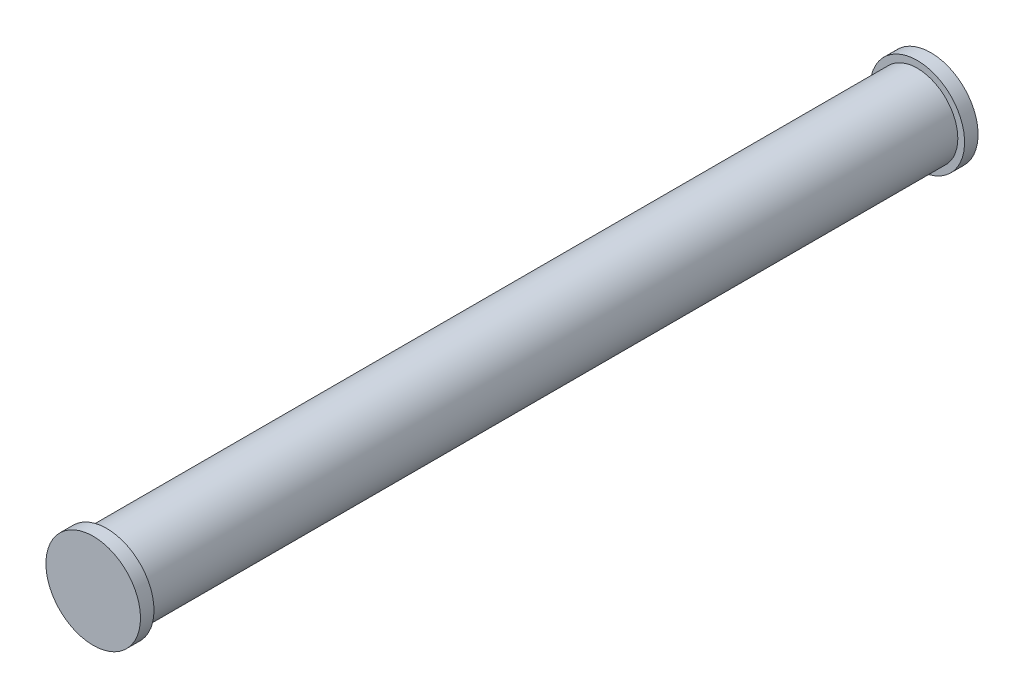
ISO-10303-21;
HEADER;
FILE_DESCRIPTION(('STEP AP214'),'2;1');
FILE_NAME('part.step','',(''),(''),'','','');
FILE_SCHEMA(('AUTOMOTIVE_DESIGN { 1 0 10303 214 1 1 1 1 }'));
ENDSEC;
DATA;
#1=APPLICATION_CONTEXT('core data for automotive mechanical design processes');
#2=APPLICATION_PROTOCOL_DEFINITION('international standard','automotive_design',2000,#1);
#3=PRODUCT_CONTEXT('',#1,'mechanical');
#4=PRODUCT('Part','Part','',(#3));
#5=PRODUCT_RELATED_PRODUCT_CATEGORY('part','',(#4));
#6=PRODUCT_DEFINITION_FORMATION('','',#4);
#7=PRODUCT_DEFINITION_CONTEXT('part definition',#1,'design');
#8=PRODUCT_DEFINITION('design','',#6,#7);
#9=PRODUCT_DEFINITION_SHAPE('','',#8);
#10=(LENGTH_UNIT() NAMED_UNIT(*) SI_UNIT(.MILLI.,.METRE.));
#11=(NAMED_UNIT(*) PLANE_ANGLE_UNIT() SI_UNIT($,.RADIAN.));
#12=(NAMED_UNIT(*) SI_UNIT($,.STERADIAN.) SOLID_ANGLE_UNIT());
#13=UNCERTAINTY_MEASURE_WITH_UNIT(LENGTH_MEASURE(1.E-05),#10,'distance_accuracy_value','');
#14=(GEOMETRIC_REPRESENTATION_CONTEXT(3) GLOBAL_UNCERTAINTY_ASSIGNED_CONTEXT((#13)) GLOBAL_UNIT_ASSIGNED_CONTEXT((#10,
#11,#12)) REPRESENTATION_CONTEXT('',''));
#15=CARTESIAN_POINT('',(0.,0.,0.));
#16=DIRECTION('',(0.,0.,1.));
#17=DIRECTION('',(1.,0.,0.));
#18=AXIS2_PLACEMENT_3D('',#15,#16,#17);
#19=CARTESIAN_POINT('',(0.,0.,-30.));
#20=DIRECTION('',(0.,0.,1.));
#21=DIRECTION('',(1.,0.,0.));
#22=AXIS2_PLACEMENT_3D('',#19,#20,#21);
#23=CYLINDRICAL_SURFACE('',#22,3.);
#24=CARTESIAN_POINT('',(0.,0.,-30.));
#25=DIRECTION('',(0.,0.,1.));
#26=DIRECTION('',(1.,0.,0.));
#27=AXIS2_PLACEMENT_3D('',#24,#25,#26);
#28=CIRCLE('',#27,3.);
#29=CARTESIAN_POINT('',(3.,0.,-30.));
#30=VERTEX_POINT('',#29);
#31=EDGE_CURVE('E40',#30,#30,#28,.T.);
#32=ORIENTED_EDGE('',*,*,#31,.T.);
#33=EDGE_LOOP('',(#32));
#34=FACE_BOUND('',#33,.T.);
#35=CARTESIAN_POINT('',(0.,0.,30.));
#36=DIRECTION('',(0.,0.,1.));
#37=DIRECTION('',(1.,0.,0.));
#38=AXIS2_PLACEMENT_3D('',#35,#36,#37);
#39=CIRCLE('',#38,3.);
#40=CARTESIAN_POINT('',(3.,0.,30.));
#41=VERTEX_POINT('',#40);
#42=EDGE_CURVE('E10',#41,#41,#39,.T.);
#43=ORIENTED_EDGE('',*,*,#42,.F.);
#44=EDGE_LOOP('',(#43));
#45=FACE_BOUND('',#44,.T.);
#46=ADVANCED_FACE('F37',(#34,#45),#23,.T.);
#47=CARTESIAN_POINT('',(0.,0.,31.));
#48=DIRECTION('',(0.,0.,-1.));
#49=DIRECTION('',(-1.,0.,0.));
#50=AXIS2_PLACEMENT_3D('',#47,#48,#49);
#51=CYLINDRICAL_SURFACE('',#50,3.5);
#52=CARTESIAN_POINT('',(0.,0.,31.));
#53=DIRECTION('',(0.,0.,1.));
#54=DIRECTION('',(1.,0.,0.));
#55=AXIS2_PLACEMENT_3D('',#52,#53,#54);
#56=CIRCLE('',#55,3.5);
#57=CARTESIAN_POINT('',(3.5,0.,31.));
#58=VERTEX_POINT('',#57);
#59=EDGE_CURVE('E45',#58,#58,#56,.T.);
#60=ORIENTED_EDGE('',*,*,#59,.F.);
#61=EDGE_LOOP('',(#60));
#62=FACE_BOUND('',#61,.T.);
#63=CARTESIAN_POINT('',(0.,0.,30.));
#64=DIRECTION('',(0.,0.,1.));
#65=DIRECTION('',(1.,0.,0.));
#66=AXIS2_PLACEMENT_3D('',#63,#64,#65);
#67=CIRCLE('',#66,3.5);
#68=CARTESIAN_POINT('',(3.5,0.,30.));
#69=VERTEX_POINT('',#68);
#70=EDGE_CURVE('E50',#69,#69,#67,.T.);
#71=ORIENTED_EDGE('',*,*,#70,.T.);
#72=EDGE_LOOP('',(#71));
#73=FACE_BOUND('',#72,.T.);
#74=ADVANCED_FACE('F92',(#62,#73),#51,.T.);
#75=CARTESIAN_POINT('',(0.,0.,31.));
#76=DIRECTION('',(0.,0.,1.));
#77=DIRECTION('',(1.,0.,0.));
#78=AXIS2_PLACEMENT_3D('',#75,#76,#77);
#79=PLANE('',#78);
#80=ORIENTED_EDGE('',*,*,#59,.T.);
#81=EDGE_LOOP('',(#80));
#82=FACE_BOUND('',#81,.T.);
#83=ADVANCED_FACE('F88',(#82),#79,.T.);
#84=CARTESIAN_POINT('',(0.,0.,30.));
#85=DIRECTION('',(0.,0.,1.));
#86=DIRECTION('',(1.,0.,0.));
#87=AXIS2_PLACEMENT_3D('',#84,#85,#86);
#88=PLANE('',#87);
#89=ORIENTED_EDGE('',*,*,#42,.T.);
#90=EDGE_LOOP('',(#89));
#91=FACE_BOUND('',#90,.T.);
#92=ORIENTED_EDGE('',*,*,#70,.F.);
#93=EDGE_LOOP('',(#92));
#94=FACE_BOUND('',#93,.T.);
#95=ADVANCED_FACE('F80',(#91,#94),#88,.F.);
#96=CARTESIAN_POINT('',(0.,0.,-31.));
#97=DIRECTION('',(0.,0.,1.));
#98=DIRECTION('',(1.,0.,0.));
#99=AXIS2_PLACEMENT_3D('',#96,#97,#98);
#100=CYLINDRICAL_SURFACE('',#99,3.5);
#101=CARTESIAN_POINT('',(0.,0.,-31.));
#102=DIRECTION('',(0.,0.,-1.));
#103=DIRECTION('',(-1.,0.,0.));
#104=AXIS2_PLACEMENT_3D('',#101,#102,#103);
#105=CIRCLE('',#104,3.5);
#106=CARTESIAN_POINT('',(-3.5,0.,-31.));
#107=VERTEX_POINT('',#106);
#108=EDGE_CURVE('E60',#107,#107,#105,.T.);
#109=ORIENTED_EDGE('',*,*,#108,.F.);
#110=EDGE_LOOP('',(#109));
#111=FACE_BOUND('',#110,.T.);
#112=CARTESIAN_POINT('',(0.,0.,-30.));
#113=DIRECTION('',(0.,0.,-1.));
#114=DIRECTION('',(-1.,0.,0.));
#115=AXIS2_PLACEMENT_3D('',#112,#113,#114);
#116=CIRCLE('',#115,3.5);
#117=CARTESIAN_POINT('',(-3.5,0.,-30.));
#118=VERTEX_POINT('',#117);
#119=EDGE_CURVE('E56',#118,#118,#116,.T.);
#120=ORIENTED_EDGE('',*,*,#119,.T.);
#121=EDGE_LOOP('',(#120));
#122=FACE_BOUND('',#121,.T.);
#123=ADVANCED_FACE('F78',(#111,#122),#100,.T.);
#124=CARTESIAN_POINT('',(0.,0.,-31.));
#125=DIRECTION('',(0.,0.,-1.));
#126=DIRECTION('',(-1.,0.,0.));
#127=AXIS2_PLACEMENT_3D('',#124,#125,#126);
#128=PLANE('',#127);
#129=ORIENTED_EDGE('',*,*,#108,.T.);
#130=EDGE_LOOP('',(#129));
#131=FACE_BOUND('',#130,.T.);
#132=ADVANCED_FACE('F74',(#131),#128,.T.);
#133=CARTESIAN_POINT('',(0.,0.,-30.));
#134=DIRECTION('',(0.,0.,-1.));
#135=DIRECTION('',(-1.,0.,0.));
#136=AXIS2_PLACEMENT_3D('',#133,#134,#135);
#137=PLANE('',#136);
#138=ORIENTED_EDGE('',*,*,#31,.F.);
#139=EDGE_LOOP('',(#138));
#140=FACE_BOUND('',#139,.T.);
#141=ORIENTED_EDGE('',*,*,#119,.F.);
#142=EDGE_LOOP('',(#141));
#143=FACE_BOUND('',#142,.T.);
#144=ADVANCED_FACE('F71',(#140,#143),#137,.F.);
#145=CLOSED_SHELL('',(#46,#74,#83,#95,#123,#132,#144));
#146=MANIFOLD_SOLID_BREP('B2',#145);
#147=ADVANCED_BREP_SHAPE_REPRESENTATION('',(#18,#146),#14);
#148=SHAPE_DEFINITION_REPRESENTATION(#9,#147);
ENDSEC;
END-ISO-10303-21;
